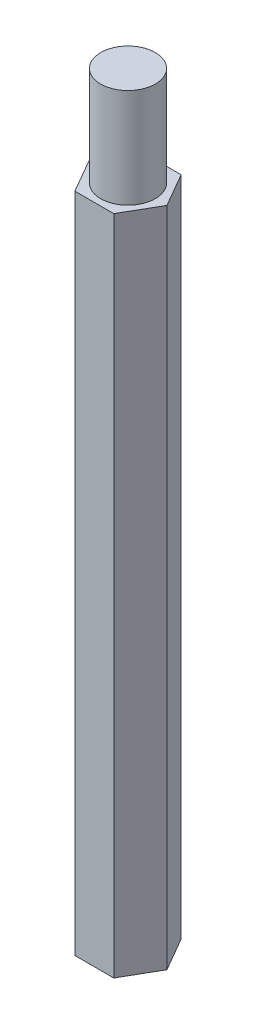
ISO-10303-21;
HEADER;
FILE_DESCRIPTION(('STEP AP214'),'2;1');
FILE_NAME('part.step','',(''),(''),'','','');
FILE_SCHEMA(('AUTOMOTIVE_DESIGN { 1 0 10303 214 1 1 1 1 }'));
ENDSEC;
DATA;
#1=APPLICATION_CONTEXT('core data for automotive mechanical design processes');
#2=APPLICATION_PROTOCOL_DEFINITION('international standard','automotive_design',2000,#1);
#3=PRODUCT_CONTEXT('',#1,'mechanical');
#4=PRODUCT('Part','Part','',(#3));
#5=PRODUCT_RELATED_PRODUCT_CATEGORY('part','',(#4));
#6=PRODUCT_DEFINITION_FORMATION('','',#4);
#7=PRODUCT_DEFINITION_CONTEXT('part definition',#1,'design');
#8=PRODUCT_DEFINITION('design','',#6,#7);
#9=PRODUCT_DEFINITION_SHAPE('','',#8);
#10=(LENGTH_UNIT() NAMED_UNIT(*) SI_UNIT(.MILLI.,.METRE.));
#11=(NAMED_UNIT(*) PLANE_ANGLE_UNIT() SI_UNIT($,.RADIAN.));
#12=(NAMED_UNIT(*) SI_UNIT($,.STERADIAN.) SOLID_ANGLE_UNIT());
#13=UNCERTAINTY_MEASURE_WITH_UNIT(LENGTH_MEASURE(1.E-05),#10,'distance_accuracy_value','');
#14=(GEOMETRIC_REPRESENTATION_CONTEXT(3) GLOBAL_UNCERTAINTY_ASSIGNED_CONTEXT((#13)) GLOBAL_UNIT_ASSIGNED_CONTEXT((#10,
#11,#12)) REPRESENTATION_CONTEXT('',''));
#15=CARTESIAN_POINT('',(0.,0.,0.));
#16=DIRECTION('',(0.,0.,1.));
#17=DIRECTION('',(1.,0.,0.));
#18=AXIS2_PLACEMENT_3D('',#15,#16,#17);
#19=CARTESIAN_POINT('',(2.35,40.,0.));
#20=DIRECTION('',(-0.866025403784439,0.,0.5));
#21=DIRECTION('',(0.5,0.,0.866025403784439));
#22=AXIS2_PLACEMENT_3D('',#19,#20,#21);
#23=PLANE('',#22);
#24=DIRECTION('',(-0.5,0.,-0.866025403784439));
#25=VECTOR('',#24,1.);
#26=CARTESIAN_POINT('',(2.35,0.,0.));
#27=LINE('',#26,#25);
#28=CARTESIAN_POINT('',(2.35,0.,0.));
#29=VERTEX_POINT('',#28);
#30=CARTESIAN_POINT('',(1.175,0.,-2.03515969889343));
#31=VERTEX_POINT('',#30);
#32=EDGE_CURVE('E121',#29,#31,#27,.T.);
#33=ORIENTED_EDGE('',*,*,#32,.T.);
#34=DIRECTION('',(0.,-1.,0.));
#35=VECTOR('',#34,1.);
#36=CARTESIAN_POINT('',(1.175,40.,-2.03515969889343));
#37=LINE('',#36,#35);
#38=CARTESIAN_POINT('',(1.175,40.,-2.03515969889343));
#39=VERTEX_POINT('',#38);
#40=EDGE_CURVE('E38',#39,#31,#37,.T.);
#41=ORIENTED_EDGE('',*,*,#40,.F.);
#42=DIRECTION('',(-0.5,0.,-0.866025403784439));
#43=VECTOR('',#42,1.);
#44=CARTESIAN_POINT('',(2.35,40.,0.));
#45=LINE('',#44,#43);
#46=CARTESIAN_POINT('',(2.35,40.,0.));
#47=VERTEX_POINT('',#46);
#48=EDGE_CURVE('E132',#47,#39,#45,.T.);
#49=ORIENTED_EDGE('',*,*,#48,.F.);
#50=DIRECTION('',(0.,-1.,0.));
#51=VECTOR('',#50,1.);
#52=CARTESIAN_POINT('',(2.35,40.,0.));
#53=LINE('',#52,#51);
#54=EDGE_CURVE('E117',#47,#29,#53,.T.);
#55=ORIENTED_EDGE('',*,*,#54,.T.);
#56=EDGE_LOOP('',(#33,#41,#49,#55));
#57=FACE_BOUND('',#56,.T.);
#58=ADVANCED_FACE('F35',(#57),#23,.F.);
#59=CARTESIAN_POINT('',(1.175,40.,-2.03515969889343));
#60=DIRECTION('',(0.,0.,1.));
#61=DIRECTION('',(1.,0.,0.));
#62=AXIS2_PLACEMENT_3D('',#59,#60,#61);
#63=PLANE('',#62);
#64=DIRECTION('',(-1.,0.,0.));
#65=VECTOR('',#64,1.);
#66=CARTESIAN_POINT('',(1.175,0.,-2.03515969889343));
#67=LINE('',#66,#65);
#68=CARTESIAN_POINT('',(-1.175,0.,-2.03515969889343));
#69=VERTEX_POINT('',#68);
#70=EDGE_CURVE('E124',#31,#69,#67,.T.);
#71=ORIENTED_EDGE('',*,*,#70,.T.);
#72=DIRECTION('',(0.,-1.,0.));
#73=VECTOR('',#72,1.);
#74=CARTESIAN_POINT('',(-1.175,40.,-2.03515969889343));
#75=LINE('',#74,#73);
#76=CARTESIAN_POINT('',(-1.175,40.,-2.03515969889343));
#77=VERTEX_POINT('',#76);
#78=EDGE_CURVE('E135',#77,#69,#75,.T.);
#79=ORIENTED_EDGE('',*,*,#78,.F.);
#80=DIRECTION('',(-1.,0.,0.));
#81=VECTOR('',#80,1.);
#82=CARTESIAN_POINT('',(1.175,40.,-2.03515969889343));
#83=LINE('',#82,#81);
#84=EDGE_CURVE('E90',#39,#77,#83,.T.);
#85=ORIENTED_EDGE('',*,*,#84,.F.);
#86=ORIENTED_EDGE('',*,*,#40,.T.);
#87=EDGE_LOOP('',(#71,#79,#85,#86));
#88=FACE_BOUND('',#87,.T.);
#89=ADVANCED_FACE('F140',(#88),#63,.F.);
#90=CARTESIAN_POINT('',(-1.175,40.,-2.03515969889343));
#91=DIRECTION('',(0.866025403784439,0.,0.5));
#92=DIRECTION('',(0.5,0.,-0.866025403784439));
#93=AXIS2_PLACEMENT_3D('',#90,#91,#92);
#94=PLANE('',#93);
#95=DIRECTION('',(-0.5,0.,0.866025403784439));
#96=VECTOR('',#95,1.);
#97=CARTESIAN_POINT('',(-1.175,0.,-2.03515969889343));
#98=LINE('',#97,#96);
#99=CARTESIAN_POINT('',(-2.35,0.,0.));
#100=VERTEX_POINT('',#99);
#101=EDGE_CURVE('E127',#69,#100,#98,.T.);
#102=ORIENTED_EDGE('',*,*,#101,.T.);
#103=DIRECTION('',(0.,-1.,0.));
#104=VECTOR('',#103,1.);
#105=CARTESIAN_POINT('',(-2.35,40.,0.));
#106=LINE('',#105,#104);
#107=CARTESIAN_POINT('',(-2.35,40.,0.));
#108=VERTEX_POINT('',#107);
#109=EDGE_CURVE('E112',#108,#100,#106,.T.);
#110=ORIENTED_EDGE('',*,*,#109,.F.);
#111=DIRECTION('',(-0.5,0.,0.866025403784439));
#112=VECTOR('',#111,1.);
#113=CARTESIAN_POINT('',(-1.175,40.,-2.03515969889343));
#114=LINE('',#113,#112);
#115=EDGE_CURVE('E103',#77,#108,#114,.T.);
#116=ORIENTED_EDGE('',*,*,#115,.F.);
#117=ORIENTED_EDGE('',*,*,#78,.T.);
#118=EDGE_LOOP('',(#102,#110,#116,#117));
#119=FACE_BOUND('',#118,.T.);
#120=ADVANCED_FACE('F146',(#119),#94,.F.);
#121=CARTESIAN_POINT('',(-2.35,40.,0.));
#122=DIRECTION('',(0.866025403784438,0.,-0.5));
#123=DIRECTION('',(-0.5,0.,-0.866025403784439));
#124=AXIS2_PLACEMENT_3D('',#121,#122,#123);
#125=PLANE('',#124);
#126=DIRECTION('',(0.5,0.,0.866025403784438));
#127=VECTOR('',#126,1.);
#128=CARTESIAN_POINT('',(-2.35,0.,0.));
#129=LINE('',#128,#127);
#130=CARTESIAN_POINT('',(-1.175,0.,2.03515969889343));
#131=VERTEX_POINT('',#130);
#132=EDGE_CURVE('E111',#100,#131,#129,.T.);
#133=ORIENTED_EDGE('',*,*,#132,.T.);
#134=DIRECTION('',(0.,-1.,0.));
#135=VECTOR('',#134,1.);
#136=CARTESIAN_POINT('',(-1.175,40.,2.03515969889343));
#137=LINE('',#136,#135);
#138=CARTESIAN_POINT('',(-1.175,40.,2.03515969889343));
#139=VERTEX_POINT('',#138);
#140=EDGE_CURVE('E108',#139,#131,#137,.T.);
#141=ORIENTED_EDGE('',*,*,#140,.F.);
#142=DIRECTION('',(0.5,0.,0.866025403784438));
#143=VECTOR('',#142,1.);
#144=CARTESIAN_POINT('',(-2.35,40.,0.));
#145=LINE('',#144,#143);
#146=EDGE_CURVE('E97',#108,#139,#145,.T.);
#147=ORIENTED_EDGE('',*,*,#146,.F.);
#148=ORIENTED_EDGE('',*,*,#109,.T.);
#149=EDGE_LOOP('',(#133,#141,#147,#148));
#150=FACE_BOUND('',#149,.T.);
#151=ADVANCED_FACE('F109',(#150),#125,.F.);
#152=CARTESIAN_POINT('',(-1.175,40.,2.03515969889343));
#153=DIRECTION('',(0.,0.,-1.));
#154=DIRECTION('',(-1.,0.,0.));
#155=AXIS2_PLACEMENT_3D('',#152,#153,#154);
#156=PLANE('',#155);
#157=DIRECTION('',(1.,0.,0.));
#158=VECTOR('',#157,1.);
#159=CARTESIAN_POINT('',(-1.175,0.,2.03515969889343));
#160=LINE('',#159,#158);
#161=CARTESIAN_POINT('',(1.175,0.,2.03515969889343));
#162=VERTEX_POINT('',#161);
#163=EDGE_CURVE('E75',#131,#162,#160,.T.);
#164=ORIENTED_EDGE('',*,*,#163,.T.);
#165=DIRECTION('',(0.,-1.,0.));
#166=VECTOR('',#165,1.);
#167=CARTESIAN_POINT('',(1.175,40.,2.03515969889343));
#168=LINE('',#167,#166);
#169=CARTESIAN_POINT('',(1.175,40.,2.03515969889343));
#170=VERTEX_POINT('',#169);
#171=EDGE_CURVE('E113',#170,#162,#168,.T.);
#172=ORIENTED_EDGE('',*,*,#171,.F.);
#173=DIRECTION('',(1.,0.,0.));
#174=VECTOR('',#173,1.);
#175=CARTESIAN_POINT('',(-1.175,40.,2.03515969889343));
#176=LINE('',#175,#174);
#177=EDGE_CURVE('E101',#139,#170,#176,.T.);
#178=ORIENTED_EDGE('',*,*,#177,.F.);
#179=ORIENTED_EDGE('',*,*,#140,.T.);
#180=EDGE_LOOP('',(#164,#172,#178,#179));
#181=FACE_BOUND('',#180,.T.);
#182=ADVANCED_FACE('F115',(#181),#156,.F.);
#183=CARTESIAN_POINT('',(1.175,40.,2.03515969889343));
#184=DIRECTION('',(-0.866025403784439,0.,-0.5));
#185=DIRECTION('',(-0.5,0.,0.866025403784439));
#186=AXIS2_PLACEMENT_3D('',#183,#184,#185);
#187=PLANE('',#186);
#188=DIRECTION('',(0.5,0.,-0.866025403784439));
#189=VECTOR('',#188,1.);
#190=CARTESIAN_POINT('',(1.175,0.,2.03515969889343));
#191=LINE('',#190,#189);
#192=EDGE_CURVE('E81',#162,#29,#191,.T.);
#193=ORIENTED_EDGE('',*,*,#192,.T.);
#194=ORIENTED_EDGE('',*,*,#54,.F.);
#195=DIRECTION('',(0.5,0.,-0.866025403784439));
#196=VECTOR('',#195,1.);
#197=CARTESIAN_POINT('',(1.175,40.,2.03515969889343));
#198=LINE('',#197,#196);
#199=EDGE_CURVE('E52',#170,#47,#198,.T.);
#200=ORIENTED_EDGE('',*,*,#199,.F.);
#201=ORIENTED_EDGE('',*,*,#171,.T.);
#202=EDGE_LOOP('',(#193,#194,#200,#201));
#203=FACE_BOUND('',#202,.T.);
#204=ADVANCED_FACE('F177',(#203),#187,.F.);
#205=CARTESIAN_POINT('',(0.,40.,0.));
#206=DIRECTION('',(0.,1.,0.));
#207=DIRECTION('',(0.,0.,1.));
#208=AXIS2_PLACEMENT_3D('',#205,#206,#207);
#209=PLANE('',#208);
#210=CARTESIAN_POINT('',(0.,40.,0.));
#211=DIRECTION('',(0.,1.,0.));
#212=DIRECTION('',(0.,0.,1.));
#213=AXIS2_PLACEMENT_3D('',#210,#211,#212);
#214=CIRCLE('',#213,1.65);
#215=CARTESIAN_POINT('',(0.,40.,1.65));
#216=VERTEX_POINT('',#215);
#217=EDGE_CURVE('E11',#216,#216,#214,.T.);
#218=ORIENTED_EDGE('',*,*,#217,.F.);
#219=EDGE_LOOP('',(#218));
#220=FACE_BOUND('',#219,.T.);
#221=ORIENTED_EDGE('',*,*,#48,.T.);
#222=ORIENTED_EDGE('',*,*,#84,.T.);
#223=ORIENTED_EDGE('',*,*,#115,.T.);
#224=ORIENTED_EDGE('',*,*,#146,.T.);
#225=ORIENTED_EDGE('',*,*,#177,.T.);
#226=ORIENTED_EDGE('',*,*,#199,.T.);
#227=EDGE_LOOP('',(#221,#222,#223,#224,#225,#226));
#228=FACE_BOUND('',#227,.T.);
#229=ADVANCED_FACE('F99',(#220,#228),#209,.T.);
#230=CARTESIAN_POINT('',(0.,0.,0.));
#231=DIRECTION('',(0.,1.,0.));
#232=DIRECTION('',(0.,0.,1.));
#233=AXIS2_PLACEMENT_3D('',#230,#231,#232);
#234=PLANE('',#233);
#235=CARTESIAN_POINT('',(0.,0.,0.));
#236=DIRECTION('',(0.,-1.,0.));
#237=DIRECTION('',(0.,0.,-1.));
#238=AXIS2_PLACEMENT_3D('',#235,#236,#237);
#239=CIRCLE('',#238,1.65);
#240=CARTESIAN_POINT('',(0.,0.,-1.65));
#241=VERTEX_POINT('',#240);
#242=EDGE_CURVE('E153',#241,#241,#239,.T.);
#243=ORIENTED_EDGE('',*,*,#242,.F.);
#244=EDGE_LOOP('',(#243));
#245=FACE_BOUND('',#244,.T.);
#246=ORIENTED_EDGE('',*,*,#32,.F.);
#247=ORIENTED_EDGE('',*,*,#192,.F.);
#248=ORIENTED_EDGE('',*,*,#163,.F.);
#249=ORIENTED_EDGE('',*,*,#132,.F.);
#250=ORIENTED_EDGE('',*,*,#101,.F.);
#251=ORIENTED_EDGE('',*,*,#70,.F.);
#252=EDGE_LOOP('',(#246,#247,#248,#249,#250,#251));
#253=FACE_BOUND('',#252,.T.);
#254=ADVANCED_FACE('F145',(#245,#253),#234,.F.);
#255=CARTESIAN_POINT('',(0.,46.,0.));
#256=DIRECTION('',(0.,-1.,0.));
#257=DIRECTION('',(0.,0.,-1.));
#258=AXIS2_PLACEMENT_3D('',#255,#256,#257);
#259=CYLINDRICAL_SURFACE('',#258,1.65);
#260=CARTESIAN_POINT('',(0.,46.,0.));
#261=DIRECTION('',(0.,1.,0.));
#262=DIRECTION('',(0.,0.,1.));
#263=AXIS2_PLACEMENT_3D('',#260,#261,#262);
#264=CIRCLE('',#263,1.65);
#265=CARTESIAN_POINT('',(0.,46.,1.65));
#266=VERTEX_POINT('',#265);
#267=EDGE_CURVE('E125',#266,#266,#264,.T.);
#268=ORIENTED_EDGE('',*,*,#267,.F.);
#269=EDGE_LOOP('',(#268));
#270=FACE_BOUND('',#269,.T.);
#271=ORIENTED_EDGE('',*,*,#217,.T.);
#272=EDGE_LOOP('',(#271));
#273=FACE_BOUND('',#272,.T.);
#274=ADVANCED_FACE('F169',(#270,#273),#259,.T.);
#275=CARTESIAN_POINT('',(0.,46.,0.));
#276=DIRECTION('',(0.,1.,0.));
#277=DIRECTION('',(0.,0.,1.));
#278=AXIS2_PLACEMENT_3D('',#275,#276,#277);
#279=PLANE('',#278);
#280=ORIENTED_EDGE('',*,*,#267,.T.);
#281=EDGE_LOOP('',(#280));
#282=FACE_BOUND('',#281,.T.);
#283=ADVANCED_FACE('F164',(#282),#279,.T.);
#284=CARTESIAN_POINT('',(0.,6.,0.));
#285=DIRECTION('',(0.,-1.,0.));
#286=DIRECTION('',(0.,0.,-1.));
#287=AXIS2_PLACEMENT_3D('',#284,#285,#286);
#288=CYLINDRICAL_SURFACE('',#287,1.65);
#289=CARTESIAN_POINT('',(0.,6.,0.));
#290=DIRECTION('',(0.,-1.,0.));
#291=DIRECTION('',(0.,0.,-1.));
#292=AXIS2_PLACEMENT_3D('',#289,#290,#291);
#293=CIRCLE('',#292,1.65);
#294=CARTESIAN_POINT('',(0.,6.,-1.65));
#295=VERTEX_POINT('',#294);
#296=EDGE_CURVE('E152',#295,#295,#293,.T.);
#297=ORIENTED_EDGE('',*,*,#296,.F.);
#298=EDGE_LOOP('',(#297));
#299=FACE_BOUND('',#298,.T.);
#300=ORIENTED_EDGE('',*,*,#242,.T.);
#301=EDGE_LOOP('',(#300));
#302=FACE_BOUND('',#301,.T.);
#303=ADVANCED_FACE('F161',(#299,#302),#288,.F.);
#304=CARTESIAN_POINT('',(0.,6.,0.));
#305=DIRECTION('',(0.,-1.,0.));
#306=DIRECTION('',(0.,0.,-1.));
#307=AXIS2_PLACEMENT_3D('',#304,#305,#306);
#308=PLANE('',#307);
#309=ORIENTED_EDGE('',*,*,#296,.T.);
#310=EDGE_LOOP('',(#309));
#311=FACE_BOUND('',#310,.T.);
#312=ADVANCED_FACE('F159',(#311),#308,.T.);
#313=CLOSED_SHELL('',(#58,#89,#120,#151,#182,#204,#229,#254,#274,#283,#303,#312));
#314=MANIFOLD_SOLID_BREP('B2',#313);
#315=ADVANCED_BREP_SHAPE_REPRESENTATION('',(#18,#314),#14);
#316=SHAPE_DEFINITION_REPRESENTATION(#9,#315);
ENDSEC;
END-ISO-10303-21;
